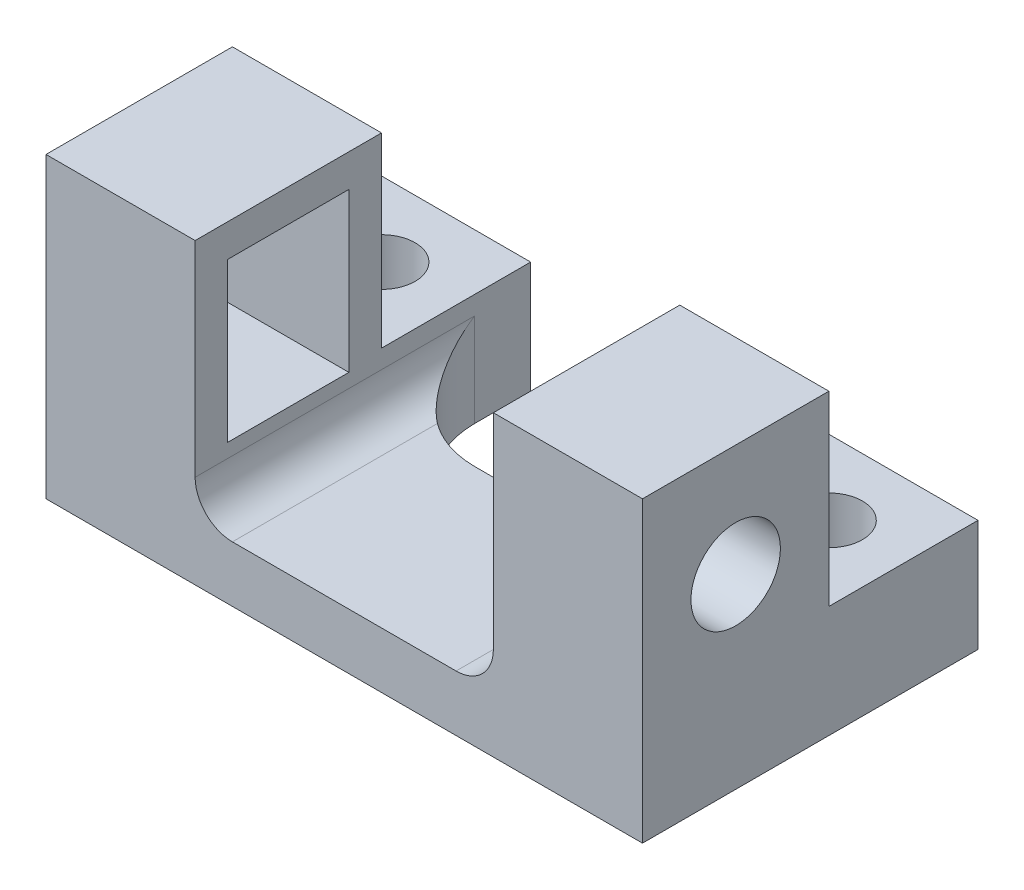
ISO-10303-21;
HEADER;
FILE_DESCRIPTION(('STEP AP214'),'2;1');
FILE_NAME('part.step','',(''),(''),'','','');
FILE_SCHEMA(('AUTOMOTIVE_DESIGN { 1 0 10303 214 1 1 1 1 }'));
ENDSEC;
DATA;
#1=APPLICATION_CONTEXT('core data for automotive mechanical design processes');
#2=APPLICATION_PROTOCOL_DEFINITION('international standard','automotive_design',2000,#1);
#3=PRODUCT_CONTEXT('',#1,'mechanical');
#4=PRODUCT('Part','Part','',(#3));
#5=PRODUCT_RELATED_PRODUCT_CATEGORY('part','',(#4));
#6=PRODUCT_DEFINITION_FORMATION('','',#4);
#7=PRODUCT_DEFINITION_CONTEXT('part definition',#1,'design');
#8=PRODUCT_DEFINITION('design','',#6,#7);
#9=PRODUCT_DEFINITION_SHAPE('','',#8);
#10=(LENGTH_UNIT() NAMED_UNIT(*) SI_UNIT(.MILLI.,.METRE.));
#11=(NAMED_UNIT(*) PLANE_ANGLE_UNIT() SI_UNIT($,.RADIAN.));
#12=(NAMED_UNIT(*) SI_UNIT($,.STERADIAN.) SOLID_ANGLE_UNIT());
#13=UNCERTAINTY_MEASURE_WITH_UNIT(LENGTH_MEASURE(1.E-05),#10,'distance_accuracy_value','');
#14=(GEOMETRIC_REPRESENTATION_CONTEXT(3) GLOBAL_UNCERTAINTY_ASSIGNED_CONTEXT((#13)) GLOBAL_UNIT_ASSIGNED_CONTEXT((#10,
#11,#12)) REPRESENTATION_CONTEXT('',''));
#15=CARTESIAN_POINT('',(0.,0.,0.));
#16=DIRECTION('',(0.,0.,1.));
#17=DIRECTION('',(1.,0.,0.));
#18=AXIS2_PLACEMENT_3D('',#15,#16,#17);
#19=CARTESIAN_POINT('',(-8.,4.,-2.5));
#20=DIRECTION('',(0.,0.,1.));
#21=DIRECTION('',(1.,0.,0.));
#22=AXIS2_PLACEMENT_3D('',#19,#20,#21);
#23=PLANE('',#22);
#24=DIRECTION('',(-1.,0.,0.));
#25=VECTOR('',#24,1.);
#26=CARTESIAN_POINT('',(-8.,-1.,-2.5));
#27=LINE('',#26,#25);
#28=CARTESIAN_POINT('',(-4.,-1.,-2.5));
#29=VERTEX_POINT('',#28);
#30=CARTESIAN_POINT('',(-8.,-1.,-2.5));
#31=VERTEX_POINT('',#30);
#32=EDGE_CURVE('E194',#29,#31,#27,.T.);
#33=ORIENTED_EDGE('',*,*,#32,.T.);
#34=DIRECTION('',(0.,-1.,0.));
#35=VECTOR('',#34,1.);
#36=CARTESIAN_POINT('',(-8.,4.,-2.5));
#37=LINE('',#36,#35);
#38=CARTESIAN_POINT('',(-8.,4.,-2.5));
#39=VERTEX_POINT('',#38);
#40=EDGE_CURVE('E208',#39,#31,#37,.T.);
#41=ORIENTED_EDGE('',*,*,#40,.F.);
#42=DIRECTION('',(-1.,0.,0.));
#43=VECTOR('',#42,1.);
#44=CARTESIAN_POINT('',(-8.,4.,-2.5));
#45=LINE('',#44,#43);
#46=CARTESIAN_POINT('',(-4.,4.,-2.5));
#47=VERTEX_POINT('',#46);
#48=EDGE_CURVE('E307',#47,#39,#45,.T.);
#49=ORIENTED_EDGE('',*,*,#48,.F.);
#50=DIRECTION('',(0.,1.,0.));
#51=VECTOR('',#50,1.);
#52=CARTESIAN_POINT('',(-4.,-2.5,-2.5));
#53=LINE('',#52,#51);
#54=EDGE_CURVE('E297',#29,#47,#53,.T.);
#55=ORIENTED_EDGE('',*,*,#54,.F.);
#56=EDGE_LOOP('',(#33,#41,#49,#55));
#57=FACE_BOUND('',#56,.T.);
#58=ADVANCED_FACE('F33',(#57),#23,.F.);
#59=DIRECTION('',(0.,-1.,0.));
#60=VECTOR('',#59,1.);
#61=CARTESIAN_POINT('',(8.,4.,-2.5));
#62=LINE('',#61,#60);
#63=CARTESIAN_POINT('',(8.,4.,-2.5));
#64=VERTEX_POINT('',#63);
#65=CARTESIAN_POINT('',(8.,-1.,-2.5));
#66=VERTEX_POINT('',#65);
#67=EDGE_CURVE('E332',#64,#66,#62,.T.);
#68=ORIENTED_EDGE('',*,*,#67,.T.);
#69=DIRECTION('',(-1.,0.,0.));
#70=VECTOR('',#69,1.);
#71=CARTESIAN_POINT('',(8.,-1.,-2.5));
#72=LINE('',#71,#70);
#73=CARTESIAN_POINT('',(4.,-1.,-2.5));
#74=VERTEX_POINT('',#73);
#75=EDGE_CURVE('E226',#66,#74,#72,.T.);
#76=ORIENTED_EDGE('',*,*,#75,.T.);
#77=DIRECTION('',(0.,1.,0.));
#78=VECTOR('',#77,1.);
#79=CARTESIAN_POINT('',(4.,-2.5,-2.5));
#80=LINE('',#79,#78);
#81=CARTESIAN_POINT('',(4.,4.,-2.5));
#82=VERTEX_POINT('',#81);
#83=EDGE_CURVE('E291',#74,#82,#80,.T.);
#84=ORIENTED_EDGE('',*,*,#83,.T.);
#85=EDGE_CURVE('E309',#64,#82,#45,.T.);
#86=ORIENTED_EDGE('',*,*,#85,.F.);
#87=EDGE_LOOP('',(#68,#76,#84,#86));
#88=FACE_BOUND('',#87,.T.);
#89=ADVANCED_FACE('F439',(#88),#23,.F.);
#90=DIRECTION('',(-1.,0.,0.));
#91=VECTOR('',#90,1.);
#92=CARTESIAN_POINT('',(-8.,-4.,-2.5));
#93=LINE('',#92,#91);
#94=CARTESIAN_POINT('',(1.5,-4.,-2.5));
#95=VERTEX_POINT('',#94);
#96=CARTESIAN_POINT('',(-1.5,-4.,-2.5));
#97=VERTEX_POINT('',#96);
#98=EDGE_CURVE('E320',#95,#97,#93,.T.);
#99=ORIENTED_EDGE('',*,*,#98,.T.);
#100=DIRECTION('',(0.,-1.,0.));
#101=VECTOR('',#100,1.);
#102=CARTESIAN_POINT('',(-1.5,4.,-2.5));
#103=LINE('',#102,#101);
#104=CARTESIAN_POINT('',(-1.5,-2.5,-2.5));
#105=VERTEX_POINT('',#104);
#106=EDGE_CURVE('E358',#97,#105,#103,.F.);
#107=ORIENTED_EDGE('',*,*,#106,.T.);
#108=DIRECTION('',(1.,0.,0.));
#109=VECTOR('',#108,1.);
#110=CARTESIAN_POINT('',(-4.,-2.5,-2.5));
#111=LINE('',#110,#109);
#112=CARTESIAN_POINT('',(1.5,-2.5,-2.5));
#113=VERTEX_POINT('',#112);
#114=EDGE_CURVE('E287',#105,#113,#111,.T.);
#115=ORIENTED_EDGE('',*,*,#114,.T.);
#116=DIRECTION('',(0.,-1.,0.));
#117=VECTOR('',#116,1.);
#118=CARTESIAN_POINT('',(1.5,4.,-2.5));
#119=LINE('',#118,#117);
#120=EDGE_CURVE('E355',#113,#95,#119,.T.);
#121=ORIENTED_EDGE('',*,*,#120,.T.);
#122=EDGE_LOOP('',(#99,#107,#115,#121));
#123=FACE_BOUND('',#122,.T.);
#124=ADVANCED_FACE('F408',(#123),#23,.F.);
#125=CARTESIAN_POINT('',(-8.,4.,2.5));
#126=DIRECTION('',(0.,0.,-1.));
#127=DIRECTION('',(-1.,0.,0.));
#128=AXIS2_PLACEMENT_3D('',#125,#126,#127);
#129=PLANE('',#128);
#130=DIRECTION('',(0.,1.,0.));
#131=VECTOR('',#130,1.);
#132=CARTESIAN_POINT('',(4.,-2.5,2.5));
#133=LINE('',#132,#131);
#134=CARTESIAN_POINT('',(4.,-1.5,2.5));
#135=VERTEX_POINT('',#134);
#136=CARTESIAN_POINT('',(4.,4.,2.5));
#137=VERTEX_POINT('',#136);
#138=EDGE_CURVE('E301',#135,#137,#133,.T.);
#139=ORIENTED_EDGE('',*,*,#138,.F.);
#140=CARTESIAN_POINT('',(3.,-1.5,2.5));
#141=DIRECTION('',(0.,0.,-1.));
#142=DIRECTION('',(-1.,0.,0.));
#143=AXIS2_PLACEMENT_3D('',#140,#141,#142);
#144=CIRCLE('',#143,1.);
#145=CARTESIAN_POINT('',(3.,-2.5,2.5));
#146=VERTEX_POINT('',#145);
#147=EDGE_CURVE('E350',#135,#146,#144,.T.);
#148=ORIENTED_EDGE('',*,*,#147,.T.);
#149=DIRECTION('',(-1.,0.,0.));
#150=VECTOR('',#149,1.);
#151=CARTESIAN_POINT('',(-4.,-2.5,2.5));
#152=LINE('',#151,#150);
#153=CARTESIAN_POINT('',(-3.,-2.5,2.5));
#154=VERTEX_POINT('',#153);
#155=EDGE_CURVE('E284',#146,#154,#152,.T.);
#156=ORIENTED_EDGE('',*,*,#155,.T.);
#157=CARTESIAN_POINT('',(-3.,-1.5,2.5));
#158=DIRECTION('',(0.,0.,-1.));
#159=DIRECTION('',(-1.,0.,0.));
#160=AXIS2_PLACEMENT_3D('',#157,#158,#159);
#161=CIRCLE('',#160,1.);
#162=CARTESIAN_POINT('',(-4.,-1.5,2.5));
#163=VERTEX_POINT('',#162);
#164=EDGE_CURVE('E348',#154,#163,#161,.T.);
#165=ORIENTED_EDGE('',*,*,#164,.T.);
#166=DIRECTION('',(0.,1.,0.));
#167=VECTOR('',#166,1.);
#168=CARTESIAN_POINT('',(-4.,-2.5,2.5));
#169=LINE('',#168,#167);
#170=CARTESIAN_POINT('',(-4.,4.,2.5));
#171=VERTEX_POINT('',#170);
#172=EDGE_CURVE('E299',#163,#171,#169,.T.);
#173=ORIENTED_EDGE('',*,*,#172,.T.);
#174=DIRECTION('',(1.,0.,0.));
#175=VECTOR('',#174,1.);
#176=CARTESIAN_POINT('',(-8.,4.,2.5));
#177=LINE('',#176,#175);
#178=CARTESIAN_POINT('',(-8.,4.,2.5));
#179=VERTEX_POINT('',#178);
#180=EDGE_CURVE('E315',#179,#171,#177,.T.);
#181=ORIENTED_EDGE('',*,*,#180,.F.);
#182=DIRECTION('',(0.,-1.,0.));
#183=VECTOR('',#182,1.);
#184=CARTESIAN_POINT('',(-8.,4.,2.5));
#185=LINE('',#184,#183);
#186=CARTESIAN_POINT('',(-8.,-4.,2.5));
#187=VERTEX_POINT('',#186);
#188=EDGE_CURVE('E328',#179,#187,#185,.T.);
#189=ORIENTED_EDGE('',*,*,#188,.T.);
#190=DIRECTION('',(1.,0.,0.));
#191=VECTOR('',#190,1.);
#192=CARTESIAN_POINT('',(-8.,-4.,2.5));
#193=LINE('',#192,#191);
#194=CARTESIAN_POINT('',(8.,-4.,2.5));
#195=VERTEX_POINT('',#194);
#196=EDGE_CURVE('E308',#187,#195,#193,.T.);
#197=ORIENTED_EDGE('',*,*,#196,.T.);
#198=DIRECTION('',(0.,-1.,0.));
#199=VECTOR('',#198,1.);
#200=CARTESIAN_POINT('',(8.,4.,2.5));
#201=LINE('',#200,#199);
#202=CARTESIAN_POINT('',(8.,4.,2.5));
#203=VERTEX_POINT('',#202);
#204=EDGE_CURVE('E318',#203,#195,#201,.T.);
#205=ORIENTED_EDGE('',*,*,#204,.F.);
#206=EDGE_CURVE('E314',#137,#203,#177,.T.);
#207=ORIENTED_EDGE('',*,*,#206,.F.);
#208=EDGE_LOOP('',(#139,#148,#156,#165,#173,#181,#189,#197,#205,#207));
#209=FACE_BOUND('',#208,.T.);
#210=ADVANCED_FACE('F414',(#209),#129,.F.);
#211=CARTESIAN_POINT('',(0.,4.,0.));
#212=DIRECTION('',(0.,-1.,0.));
#213=DIRECTION('',(0.,0.,-1.));
#214=AXIS2_PLACEMENT_3D('',#211,#212,#213);
#215=PLANE('',#214);
#216=DIRECTION('',(0.,0.,1.));
#217=VECTOR('',#216,1.);
#218=CARTESIAN_POINT('',(4.,4.,2.5));
#219=LINE('',#218,#217);
#220=EDGE_CURVE('E283',#82,#137,#219,.T.);
#221=ORIENTED_EDGE('',*,*,#220,.T.);
#222=ORIENTED_EDGE('',*,*,#206,.T.);
#223=DIRECTION('',(0.,0.,-1.));
#224=VECTOR('',#223,1.);
#225=CARTESIAN_POINT('',(8.,4.,2.5));
#226=LINE('',#225,#224);
#227=EDGE_CURVE('E304',#203,#64,#226,.T.);
#228=ORIENTED_EDGE('',*,*,#227,.T.);
#229=ORIENTED_EDGE('',*,*,#85,.T.);
#230=EDGE_LOOP('',(#221,#222,#228,#229));
#231=FACE_BOUND('',#230,.T.);
#232=ADVANCED_FACE('F434',(#231),#215,.F.);
#233=DIRECTION('',(0.,0.,-1.));
#234=VECTOR('',#233,1.);
#235=CARTESIAN_POINT('',(-4.,4.,2.5));
#236=LINE('',#235,#234);
#237=EDGE_CURVE('E288',#171,#47,#236,.T.);
#238=ORIENTED_EDGE('',*,*,#237,.T.);
#239=ORIENTED_EDGE('',*,*,#48,.T.);
#240=DIRECTION('',(0.,0.,1.));
#241=VECTOR('',#240,1.);
#242=CARTESIAN_POINT('',(-8.,4.,2.5));
#243=LINE('',#242,#241);
#244=EDGE_CURVE('E312',#39,#179,#243,.T.);
#245=ORIENTED_EDGE('',*,*,#244,.T.);
#246=ORIENTED_EDGE('',*,*,#180,.T.);
#247=EDGE_LOOP('',(#238,#239,#245,#246));
#248=FACE_BOUND('',#247,.T.);
#249=ADVANCED_FACE('F425',(#248),#215,.F.);
#250=CARTESIAN_POINT('',(8.,4.,2.5));
#251=DIRECTION('',(-1.,0.,0.));
#252=DIRECTION('',(0.,0.,1.));
#253=AXIS2_PLACEMENT_3D('',#250,#251,#252);
#254=PLANE('',#253);
#255=CARTESIAN_POINT('',(8.,1.,0.));
#256=DIRECTION('',(1.,0.,0.));
#257=DIRECTION('',(0.,0.,-1.));
#258=AXIS2_PLACEMENT_3D('',#255,#256,#257);
#259=CIRCLE('',#258,1.19999999999999);
#260=CARTESIAN_POINT('',(8.,1.,-1.19999999999999));
#261=VERTEX_POINT('',#260);
#262=EDGE_CURVE('E243',#261,#261,#259,.T.);
#263=ORIENTED_EDGE('',*,*,#262,.F.);
#264=EDGE_LOOP('',(#263));
#265=FACE_BOUND('',#264,.T.);
#266=DIRECTION('',(0.,0.,-1.));
#267=VECTOR('',#266,1.);
#268=CARTESIAN_POINT('',(8.,-4.,2.5));
#269=LINE('',#268,#267);
#270=CARTESIAN_POINT('',(8.,-4.,-6.5));
#271=VERTEX_POINT('',#270);
#272=EDGE_CURVE('E303',#195,#271,#269,.T.);
#273=ORIENTED_EDGE('',*,*,#272,.T.);
#274=DIRECTION('',(0.,-1.,0.));
#275=VECTOR('',#274,1.);
#276=CARTESIAN_POINT('',(8.,-1.,-6.5));
#277=LINE('',#276,#275);
#278=CARTESIAN_POINT('',(8.,-1.,-6.5));
#279=VERTEX_POINT('',#278);
#280=EDGE_CURVE('E240',#279,#271,#277,.T.);
#281=ORIENTED_EDGE('',*,*,#280,.F.);
#282=DIRECTION('',(0.,0.,1.));
#283=VECTOR('',#282,1.);
#284=CARTESIAN_POINT('',(8.,-1.,-2.5));
#285=LINE('',#284,#283);
#286=EDGE_CURVE('E223',#279,#66,#285,.T.);
#287=ORIENTED_EDGE('',*,*,#286,.T.);
#288=ORIENTED_EDGE('',*,*,#67,.F.);
#289=ORIENTED_EDGE('',*,*,#227,.F.);
#290=ORIENTED_EDGE('',*,*,#204,.T.);
#291=EDGE_LOOP('',(#273,#281,#287,#288,#289,#290));
#292=FACE_BOUND('',#291,.T.);
#293=ADVANCED_FACE('F431',(#265,#292),#254,.F.);
#294=CARTESIAN_POINT('',(-8.,4.,2.5));
#295=DIRECTION('',(1.,0.,0.));
#296=DIRECTION('',(0.,0.,-1.));
#297=AXIS2_PLACEMENT_3D('',#294,#295,#296);
#298=PLANE('',#297);
#299=DIRECTION('',(0.,1.,0.));
#300=VECTOR('',#299,1.);
#301=CARTESIAN_POINT('',(-8.,3.125,1.625));
#302=LINE('',#301,#300);
#303=CARTESIAN_POINT('',(-8.,-1.125,1.625));
#304=VERTEX_POINT('',#303);
#305=CARTESIAN_POINT('',(-8.,3.125,1.625));
#306=VERTEX_POINT('',#305);
#307=EDGE_CURVE('E255',#304,#306,#302,.T.);
#308=ORIENTED_EDGE('',*,*,#307,.F.);
#309=DIRECTION('',(0.,0.,1.));
#310=VECTOR('',#309,1.);
#311=CARTESIAN_POINT('',(-8.,-1.125,-1.625));
#312=LINE('',#311,#310);
#313=CARTESIAN_POINT('',(-8.,-1.125,-1.625));
#314=VERTEX_POINT('',#313);
#315=EDGE_CURVE('E258',#314,#304,#312,.T.);
#316=ORIENTED_EDGE('',*,*,#315,.F.);
#317=DIRECTION('',(0.,-1.,0.));
#318=VECTOR('',#317,1.);
#319=CARTESIAN_POINT('',(-8.,3.125,-1.625));
#320=LINE('',#319,#318);
#321=CARTESIAN_POINT('',(-8.,3.125,-1.625));
#322=VERTEX_POINT('',#321);
#323=EDGE_CURVE('E251',#322,#314,#320,.T.);
#324=ORIENTED_EDGE('',*,*,#323,.F.);
#325=DIRECTION('',(0.,0.,-1.));
#326=VECTOR('',#325,1.);
#327=CARTESIAN_POINT('',(-8.,3.125,-1.625));
#328=LINE('',#327,#326);
#329=EDGE_CURVE('E252',#306,#322,#328,.T.);
#330=ORIENTED_EDGE('',*,*,#329,.F.);
#331=EDGE_LOOP('',(#308,#316,#324,#330));
#332=FACE_BOUND('',#331,.T.);
#333=DIRECTION('',(0.,0.,1.));
#334=VECTOR('',#333,1.);
#335=CARTESIAN_POINT('',(-8.,-4.,2.5));
#336=LINE('',#335,#334);
#337=CARTESIAN_POINT('',(-8.,-4.,-6.5));
#338=VERTEX_POINT('',#337);
#339=EDGE_CURVE('E323',#338,#187,#336,.T.);
#340=ORIENTED_EDGE('',*,*,#339,.T.);
#341=ORIENTED_EDGE('',*,*,#188,.F.);
#342=ORIENTED_EDGE('',*,*,#244,.F.);
#343=ORIENTED_EDGE('',*,*,#40,.T.);
#344=DIRECTION('',(0.,0.,-1.));
#345=VECTOR('',#344,1.);
#346=CARTESIAN_POINT('',(-8.,-1.,-2.5));
#347=LINE('',#346,#345);
#348=CARTESIAN_POINT('',(-8.,-1.,-6.5));
#349=VERTEX_POINT('',#348);
#350=EDGE_CURVE('E199',#31,#349,#347,.T.);
#351=ORIENTED_EDGE('',*,*,#350,.T.);
#352=DIRECTION('',(0.,-1.,0.));
#353=VECTOR('',#352,1.);
#354=CARTESIAN_POINT('',(-8.,-1.,-6.5));
#355=LINE('',#354,#353);
#356=EDGE_CURVE('E185',#349,#338,#355,.T.);
#357=ORIENTED_EDGE('',*,*,#356,.T.);
#358=EDGE_LOOP('',(#340,#341,#342,#343,#351,#357));
#359=FACE_BOUND('',#358,.T.);
#360=ADVANCED_FACE('F205',(#332,#359),#298,.F.);
#361=CARTESIAN_POINT('',(0.,-4.,0.));
#362=DIRECTION('',(0.,-1.,0.));
#363=DIRECTION('',(0.,0.,-1.));
#364=AXIS2_PLACEMENT_3D('',#361,#362,#363);
#365=PLANE('',#364);
#366=CARTESIAN_POINT('',(6.,-4.,-4.5));
#367=DIRECTION('',(0.,-1.,0.));
#368=DIRECTION('',(0.,0.,-1.));
#369=AXIS2_PLACEMENT_3D('',#366,#367,#368);
#370=CIRCLE('',#369,0.899999999999999);
#371=CARTESIAN_POINT('',(6.,-4.,-5.4));
#372=VERTEX_POINT('',#371);
#373=EDGE_CURVE('E338',#372,#372,#370,.T.);
#374=ORIENTED_EDGE('',*,*,#373,.F.);
#375=EDGE_LOOP('',(#374));
#376=FACE_BOUND('',#375,.T.);
#377=CARTESIAN_POINT('',(-6.,-4.,-4.5));
#378=DIRECTION('',(0.,-1.,0.));
#379=DIRECTION('',(0.,0.,-1.));
#380=AXIS2_PLACEMENT_3D('',#377,#378,#379);
#381=CIRCLE('',#380,0.899999999999999);
#382=CARTESIAN_POINT('',(-6.,-4.,-5.4));
#383=VERTEX_POINT('',#382);
#384=EDGE_CURVE('E219',#383,#383,#381,.T.);
#385=ORIENTED_EDGE('',*,*,#384,.F.);
#386=EDGE_LOOP('',(#385));
#387=FACE_BOUND('',#386,.T.);
#388=ORIENTED_EDGE('',*,*,#272,.F.);
#389=ORIENTED_EDGE('',*,*,#196,.F.);
#390=ORIENTED_EDGE('',*,*,#339,.F.);
#391=DIRECTION('',(1.,0.,0.));
#392=VECTOR('',#391,1.);
#393=CARTESIAN_POINT('',(-8.,-4.,-6.5));
#394=LINE('',#393,#392);
#395=CARTESIAN_POINT('',(-4.,-4.,-6.5));
#396=VERTEX_POINT('',#395);
#397=EDGE_CURVE('E190',#338,#396,#394,.T.);
#398=ORIENTED_EDGE('',*,*,#397,.T.);
#399=DIRECTION('',(0.,0.,1.));
#400=VECTOR('',#399,1.);
#401=CARTESIAN_POINT('',(-4.,-4.,-2.5));
#402=LINE('',#401,#400);
#403=CARTESIAN_POINT('',(-4.,-4.,-5.));
#404=VERTEX_POINT('',#403);
#405=EDGE_CURVE('E209',#396,#404,#402,.T.);
#406=ORIENTED_EDGE('',*,*,#405,.T.);
#407=CARTESIAN_POINT('',(-1.5,-4.,-5.));
#408=DIRECTION('',(0.,-1.,0.));
#409=DIRECTION('',(0.,0.,-1.));
#410=AXIS2_PLACEMENT_3D('',#407,#408,#409);
#411=CIRCLE('',#410,2.5);
#412=EDGE_CURVE('E363',#404,#97,#411,.F.);
#413=ORIENTED_EDGE('',*,*,#412,.T.);
#414=ORIENTED_EDGE('',*,*,#98,.F.);
#415=CARTESIAN_POINT('',(1.5,-4.,-5.));
#416=DIRECTION('',(0.,-1.,0.));
#417=DIRECTION('',(0.,0.,-1.));
#418=AXIS2_PLACEMENT_3D('',#415,#416,#417);
#419=CIRCLE('',#418,2.5);
#420=CARTESIAN_POINT('',(4.,-4.,-5.));
#421=VERTEX_POINT('',#420);
#422=EDGE_CURVE('E374',#95,#421,#419,.F.);
#423=ORIENTED_EDGE('',*,*,#422,.T.);
#424=DIRECTION('',(0.,0.,-1.));
#425=VECTOR('',#424,1.);
#426=CARTESIAN_POINT('',(4.,-4.,-2.5));
#427=LINE('',#426,#425);
#428=CARTESIAN_POINT('',(4.,-4.,-6.5));
#429=VERTEX_POINT('',#428);
#430=EDGE_CURVE('E221',#421,#429,#427,.T.);
#431=ORIENTED_EDGE('',*,*,#430,.T.);
#432=DIRECTION('',(1.,0.,0.));
#433=VECTOR('',#432,1.);
#434=CARTESIAN_POINT('',(8.,-4.,-6.5));
#435=LINE('',#434,#433);
#436=EDGE_CURVE('E227',#429,#271,#435,.T.);
#437=ORIENTED_EDGE('',*,*,#436,.T.);
#438=EDGE_LOOP('',(#388,#389,#390,#398,#406,#413,#414,#423,#431,#437));
#439=FACE_BOUND('',#438,.T.);
#440=ADVANCED_FACE('F397',(#376,#387,#439),#365,.T.);
#441=CARTESIAN_POINT('',(4.,-2.5,2.5));
#442=DIRECTION('',(-1.,0.,0.));
#443=DIRECTION('',(0.,0.,1.));
#444=AXIS2_PLACEMENT_3D('',#441,#442,#443);
#445=PLANE('',#444);
#446=CARTESIAN_POINT('',(4.,1.,0.));
#447=DIRECTION('',(1.,0.,0.));
#448=DIRECTION('',(0.,0.,-1.));
#449=AXIS2_PLACEMENT_3D('',#446,#447,#448);
#450=CIRCLE('',#449,1.19999999999999);
#451=CARTESIAN_POINT('',(4.,1.,-1.19999999999999));
#452=VERTEX_POINT('',#451);
#453=EDGE_CURVE('E248',#452,#452,#450,.T.);
#454=ORIENTED_EDGE('',*,*,#453,.T.);
#455=EDGE_LOOP('',(#454));
#456=FACE_BOUND('',#455,.T.);
#457=ORIENTED_EDGE('',*,*,#430,.F.);
#458=DIRECTION('',(0.,-1.,0.));
#459=VECTOR('',#458,1.);
#460=CARTESIAN_POINT('',(4.,-2.5,-5.));
#461=LINE('',#460,#459);
#462=CARTESIAN_POINT('',(4.,-1.5,-5.));
#463=VERTEX_POINT('',#462);
#464=EDGE_CURVE('E360',#421,#463,#461,.F.);
#465=ORIENTED_EDGE('',*,*,#464,.T.);
#466=DIRECTION('',(0.,0.,1.));
#467=VECTOR('',#466,1.);
#468=CARTESIAN_POINT('',(4.,-1.5,2.5));
#469=LINE('',#468,#467);
#470=EDGE_CURVE('E345',#463,#135,#469,.T.);
#471=ORIENTED_EDGE('',*,*,#470,.T.);
#472=ORIENTED_EDGE('',*,*,#138,.T.);
#473=ORIENTED_EDGE('',*,*,#220,.F.);
#474=ORIENTED_EDGE('',*,*,#83,.F.);
#475=DIRECTION('',(0.,0.,-1.));
#476=VECTOR('',#475,1.);
#477=CARTESIAN_POINT('',(4.,-1.,-2.5));
#478=LINE('',#477,#476);
#479=CARTESIAN_POINT('',(4.,-1.,-6.5));
#480=VERTEX_POINT('',#479);
#481=EDGE_CURVE('E230',#74,#480,#478,.T.);
#482=ORIENTED_EDGE('',*,*,#481,.T.);
#483=DIRECTION('',(0.,-1.,0.));
#484=VECTOR('',#483,1.);
#485=CARTESIAN_POINT('',(4.,-1.,-6.5));
#486=LINE('',#485,#484);
#487=EDGE_CURVE('E236',#480,#429,#486,.T.);
#488=ORIENTED_EDGE('',*,*,#487,.T.);
#489=EDGE_LOOP('',(#457,#465,#471,#472,#473,#474,#482,#488));
#490=FACE_BOUND('',#489,.T.);
#491=ADVANCED_FACE('F402',(#456,#490),#445,.T.);
#492=CARTESIAN_POINT('',(-4.,-2.5,2.5));
#493=DIRECTION('',(1.,0.,0.));
#494=DIRECTION('',(0.,0.,-1.));
#495=AXIS2_PLACEMENT_3D('',#492,#493,#494);
#496=PLANE('',#495);
#497=DIRECTION('',(0.,0.,1.));
#498=VECTOR('',#497,1.);
#499=CARTESIAN_POINT('',(-4.,-1.125,-1.625));
#500=LINE('',#499,#498);
#501=CARTESIAN_POINT('',(-4.,-1.125,-1.625));
#502=VERTEX_POINT('',#501);
#503=CARTESIAN_POINT('',(-4.,-1.125,1.625));
#504=VERTEX_POINT('',#503);
#505=EDGE_CURVE('E254',#502,#504,#500,.T.);
#506=ORIENTED_EDGE('',*,*,#505,.T.);
#507=DIRECTION('',(0.,1.,0.));
#508=VECTOR('',#507,1.);
#509=CARTESIAN_POINT('',(-4.,3.125,1.625));
#510=LINE('',#509,#508);
#511=CARTESIAN_POINT('',(-4.,3.125,1.625));
#512=VERTEX_POINT('',#511);
#513=EDGE_CURVE('E275',#504,#512,#510,.T.);
#514=ORIENTED_EDGE('',*,*,#513,.T.);
#515=DIRECTION('',(0.,0.,-1.));
#516=VECTOR('',#515,1.);
#517=CARTESIAN_POINT('',(-4.,3.125,-1.625));
#518=LINE('',#517,#516);
#519=CARTESIAN_POINT('',(-4.,3.125,-1.625));
#520=VERTEX_POINT('',#519);
#521=EDGE_CURVE('E271',#512,#520,#518,.T.);
#522=ORIENTED_EDGE('',*,*,#521,.T.);
#523=DIRECTION('',(0.,-1.,0.));
#524=VECTOR('',#523,1.);
#525=CARTESIAN_POINT('',(-4.,3.125,-1.625));
#526=LINE('',#525,#524);
#527=EDGE_CURVE('E266',#520,#502,#526,.T.);
#528=ORIENTED_EDGE('',*,*,#527,.T.);
#529=EDGE_LOOP('',(#506,#514,#522,#528));
#530=FACE_BOUND('',#529,.T.);
#531=DIRECTION('',(0.,0.,-1.));
#532=VECTOR('',#531,1.);
#533=CARTESIAN_POINT('',(-4.,-1.5,2.5));
#534=LINE('',#533,#532);
#535=CARTESIAN_POINT('',(-4.,-1.5,-5.));
#536=VERTEX_POINT('',#535);
#537=EDGE_CURVE('E335',#163,#536,#534,.T.);
#538=ORIENTED_EDGE('',*,*,#537,.T.);
#539=DIRECTION('',(0.,-1.,0.));
#540=VECTOR('',#539,1.);
#541=CARTESIAN_POINT('',(-4.,-2.5,-5.));
#542=LINE('',#541,#540);
#543=EDGE_CURVE('E352',#536,#404,#542,.T.);
#544=ORIENTED_EDGE('',*,*,#543,.T.);
#545=ORIENTED_EDGE('',*,*,#405,.F.);
#546=DIRECTION('',(0.,-1.,0.));
#547=VECTOR('',#546,1.);
#548=CARTESIAN_POINT('',(-4.,-1.,-6.5));
#549=LINE('',#548,#547);
#550=CARTESIAN_POINT('',(-4.,-1.,-6.5));
#551=VERTEX_POINT('',#550);
#552=EDGE_CURVE('E193',#551,#396,#549,.T.);
#553=ORIENTED_EDGE('',*,*,#552,.F.);
#554=DIRECTION('',(0.,0.,1.));
#555=VECTOR('',#554,1.);
#556=CARTESIAN_POINT('',(-4.,-1.,-2.5));
#557=LINE('',#556,#555);
#558=EDGE_CURVE('E202',#551,#29,#557,.T.);
#559=ORIENTED_EDGE('',*,*,#558,.T.);
#560=ORIENTED_EDGE('',*,*,#54,.T.);
#561=ORIENTED_EDGE('',*,*,#237,.F.);
#562=ORIENTED_EDGE('',*,*,#172,.F.);
#563=EDGE_LOOP('',(#538,#544,#545,#553,#559,#560,#561,#562));
#564=FACE_BOUND('',#563,.T.);
#565=ADVANCED_FACE('F418',(#530,#564),#496,.T.);
#566=CARTESIAN_POINT('',(0.,-2.5,0.));
#567=DIRECTION('',(0.,-1.,0.));
#568=DIRECTION('',(0.,0.,-1.));
#569=AXIS2_PLACEMENT_3D('',#566,#567,#568);
#570=PLANE('',#569);
#571=ORIENTED_EDGE('',*,*,#114,.F.);
#572=CARTESIAN_POINT('',(-1.5,-2.5,-5.));
#573=DIRECTION('',(0.,-1.,0.));
#574=DIRECTION('',(0.,0.,-1.));
#575=AXIS2_PLACEMENT_3D('',#572,#573,#574);
#576=CIRCLE('',#575,2.5);
#577=CARTESIAN_POINT('',(-3.,-2.5,-2.99999999999967));
#578=VERTEX_POINT('',#577);
#579=EDGE_CURVE('E365',#105,#578,#576,.T.);
#580=ORIENTED_EDGE('',*,*,#579,.T.);
#581=DIRECTION('',(0.,0.,-1.));
#582=VECTOR('',#581,1.);
#583=CARTESIAN_POINT('',(-3.,-2.5,0.));
#584=LINE('',#583,#582);
#585=EDGE_CURVE('E56',#578,#154,#584,.F.);
#586=ORIENTED_EDGE('',*,*,#585,.T.);
#587=ORIENTED_EDGE('',*,*,#155,.F.);
#588=DIRECTION('',(0.,0.,1.));
#589=VECTOR('',#588,1.);
#590=CARTESIAN_POINT('',(3.,-2.5,0.));
#591=LINE('',#590,#589);
#592=CARTESIAN_POINT('',(3.,-2.5,-2.99999999999967));
#593=VERTEX_POINT('',#592);
#594=EDGE_CURVE('E48',#146,#593,#591,.F.);
#595=ORIENTED_EDGE('',*,*,#594,.T.);
#596=CARTESIAN_POINT('',(1.5,-2.5,-5.));
#597=DIRECTION('',(0.,-1.,0.));
#598=DIRECTION('',(0.,0.,-1.));
#599=AXIS2_PLACEMENT_3D('',#596,#597,#598);
#600=CIRCLE('',#599,2.5);
#601=EDGE_CURVE('E11',#593,#113,#600,.T.);
#602=ORIENTED_EDGE('',*,*,#601,.T.);
#603=EDGE_LOOP('',(#571,#580,#586,#587,#595,#602));
#604=FACE_BOUND('',#603,.T.);
#605=ADVANCED_FACE('F405',(#604),#570,.F.);
#606=CARTESIAN_POINT('',(1.35023363975818,-1.125,-1.625));
#607=DIRECTION('',(0.,-1.,0.));
#608=DIRECTION('',(0.,0.,-1.));
#609=AXIS2_PLACEMENT_3D('',#606,#607,#608);
#610=PLANE('',#609);
#611=DIRECTION('',(-1.,0.,0.));
#612=VECTOR('',#611,1.);
#613=CARTESIAN_POINT('',(1.35023363975818,-1.125,-1.625));
#614=LINE('',#613,#612);
#615=EDGE_CURVE('E269',#502,#314,#614,.T.);
#616=ORIENTED_EDGE('',*,*,#615,.T.);
#617=ORIENTED_EDGE('',*,*,#315,.T.);
#618=DIRECTION('',(-1.,0.,0.));
#619=VECTOR('',#618,1.);
#620=CARTESIAN_POINT('',(1.35023363975818,-1.125,1.625));
#621=LINE('',#620,#619);
#622=EDGE_CURVE('E265',#504,#304,#621,.T.);
#623=ORIENTED_EDGE('',*,*,#622,.F.);
#624=ORIENTED_EDGE('',*,*,#505,.F.);
#625=EDGE_LOOP('',(#616,#617,#623,#624));
#626=FACE_BOUND('',#625,.T.);
#627=ADVANCED_FACE('F497',(#626),#610,.F.);
#628=CARTESIAN_POINT('',(1.35023363975818,3.125,1.625));
#629=DIRECTION('',(0.,0.,1.));
#630=DIRECTION('',(0.,-1.,0.));
#631=AXIS2_PLACEMENT_3D('',#628,#629,#630);
#632=PLANE('',#631);
#633=ORIENTED_EDGE('',*,*,#622,.T.);
#634=ORIENTED_EDGE('',*,*,#307,.T.);
#635=DIRECTION('',(-1.,0.,0.));
#636=VECTOR('',#635,1.);
#637=CARTESIAN_POINT('',(1.35023363975818,3.125,1.625));
#638=LINE('',#637,#636);
#639=EDGE_CURVE('E274',#512,#306,#638,.T.);
#640=ORIENTED_EDGE('',*,*,#639,.F.);
#641=ORIENTED_EDGE('',*,*,#513,.F.);
#642=EDGE_LOOP('',(#633,#634,#640,#641));
#643=FACE_BOUND('',#642,.T.);
#644=ADVANCED_FACE('F493',(#643),#632,.F.);
#645=CARTESIAN_POINT('',(1.35023363975818,3.125,-1.625));
#646=DIRECTION('',(0.,1.,0.));
#647=DIRECTION('',(0.,0.,1.));
#648=AXIS2_PLACEMENT_3D('',#645,#646,#647);
#649=PLANE('',#648);
#650=ORIENTED_EDGE('',*,*,#639,.T.);
#651=ORIENTED_EDGE('',*,*,#329,.T.);
#652=DIRECTION('',(-1.,0.,0.));
#653=VECTOR('',#652,1.);
#654=CARTESIAN_POINT('',(1.35023363975818,3.125,-1.625));
#655=LINE('',#654,#653);
#656=EDGE_CURVE('E270',#520,#322,#655,.T.);
#657=ORIENTED_EDGE('',*,*,#656,.F.);
#658=ORIENTED_EDGE('',*,*,#521,.F.);
#659=EDGE_LOOP('',(#650,#651,#657,#658));
#660=FACE_BOUND('',#659,.T.);
#661=ADVANCED_FACE('F501',(#660),#649,.F.);
#662=CARTESIAN_POINT('',(1.35023363975818,3.125,-1.625));
#663=DIRECTION('',(0.,0.,-1.));
#664=DIRECTION('',(0.,1.,0.));
#665=AXIS2_PLACEMENT_3D('',#662,#663,#664);
#666=PLANE('',#665);
#667=ORIENTED_EDGE('',*,*,#656,.T.);
#668=ORIENTED_EDGE('',*,*,#323,.T.);
#669=ORIENTED_EDGE('',*,*,#615,.F.);
#670=ORIENTED_EDGE('',*,*,#527,.F.);
#671=EDGE_LOOP('',(#667,#668,#669,#670));
#672=FACE_BOUND('',#671,.T.);
#673=ADVANCED_FACE('F456',(#672),#666,.F.);
#674=CARTESIAN_POINT('',(8.,1.,0.));
#675=DIRECTION('',(1.,0.,0.));
#676=DIRECTION('',(0.,0.,-1.));
#677=AXIS2_PLACEMENT_3D('',#674,#675,#676);
#678=CYLINDRICAL_SURFACE('',#677,1.19999999999999);
#679=ORIENTED_EDGE('',*,*,#453,.F.);
#680=EDGE_LOOP('',(#679));
#681=FACE_BOUND('',#680,.T.);
#682=ORIENTED_EDGE('',*,*,#262,.T.);
#683=EDGE_LOOP('',(#682));
#684=FACE_BOUND('',#683,.T.);
#685=ADVANCED_FACE('F446',(#681,#684),#678,.F.);
#686=CARTESIAN_POINT('',(8.,-1.,-6.5));
#687=DIRECTION('',(0.,0.,-1.));
#688=DIRECTION('',(-1.,0.,0.));
#689=AXIS2_PLACEMENT_3D('',#686,#687,#688);
#690=PLANE('',#689);
#691=ORIENTED_EDGE('',*,*,#436,.F.);
#692=ORIENTED_EDGE('',*,*,#487,.F.);
#693=DIRECTION('',(1.,0.,0.));
#694=VECTOR('',#693,1.);
#695=CARTESIAN_POINT('',(8.,-1.,-6.5));
#696=LINE('',#695,#694);
#697=EDGE_CURVE('E233',#480,#279,#696,.T.);
#698=ORIENTED_EDGE('',*,*,#697,.T.);
#699=ORIENTED_EDGE('',*,*,#280,.T.);
#700=EDGE_LOOP('',(#691,#692,#698,#699));
#701=FACE_BOUND('',#700,.T.);
#702=ADVANCED_FACE('F444',(#701),#690,.T.);
#703=CARTESIAN_POINT('',(0.,-1.,0.));
#704=DIRECTION('',(0.,1.,0.));
#705=DIRECTION('',(0.,0.,1.));
#706=AXIS2_PLACEMENT_3D('',#703,#704,#705);
#707=PLANE('',#706);
#708=CARTESIAN_POINT('',(6.,-1.,-4.5));
#709=DIRECTION('',(0.,1.,0.));
#710=DIRECTION('',(0.,0.,1.));
#711=AXIS2_PLACEMENT_3D('',#708,#709,#710);
#712=CIRCLE('',#711,0.9);
#713=CARTESIAN_POINT('',(6.,-1.,-3.6));
#714=VERTEX_POINT('',#713);
#715=EDGE_CURVE('E341',#714,#714,#712,.T.);
#716=ORIENTED_EDGE('',*,*,#715,.F.);
#717=EDGE_LOOP('',(#716));
#718=FACE_BOUND('',#717,.T.);
#719=ORIENTED_EDGE('',*,*,#286,.F.);
#720=ORIENTED_EDGE('',*,*,#697,.F.);
#721=ORIENTED_EDGE('',*,*,#481,.F.);
#722=ORIENTED_EDGE('',*,*,#75,.F.);
#723=EDGE_LOOP('',(#719,#720,#721,#722));
#724=FACE_BOUND('',#723,.T.);
#725=ADVANCED_FACE('F442',(#718,#724),#707,.T.);
#726=CARTESIAN_POINT('',(-8.,-1.,-6.5));
#727=DIRECTION('',(0.,0.,-1.));
#728=DIRECTION('',(-1.,0.,0.));
#729=AXIS2_PLACEMENT_3D('',#726,#727,#728);
#730=PLANE('',#729);
#731=ORIENTED_EDGE('',*,*,#397,.F.);
#732=ORIENTED_EDGE('',*,*,#356,.F.);
#733=DIRECTION('',(1.,0.,0.));
#734=VECTOR('',#733,1.);
#735=CARTESIAN_POINT('',(-8.,-1.,-6.5));
#736=LINE('',#735,#734);
#737=EDGE_CURVE('E188',#349,#551,#736,.T.);
#738=ORIENTED_EDGE('',*,*,#737,.T.);
#739=ORIENTED_EDGE('',*,*,#552,.T.);
#740=EDGE_LOOP('',(#731,#732,#738,#739));
#741=FACE_BOUND('',#740,.T.);
#742=ADVANCED_FACE('F187',(#741),#730,.T.);
#743=CARTESIAN_POINT('',(0.,-1.,0.));
#744=DIRECTION('',(0.,-1.,0.));
#745=DIRECTION('',(0.,0.,-1.));
#746=AXIS2_PLACEMENT_3D('',#743,#744,#745);
#747=PLANE('',#746);
#748=CARTESIAN_POINT('',(-6.,-1.,-4.5));
#749=DIRECTION('',(0.,1.,0.));
#750=DIRECTION('',(0.,0.,1.));
#751=AXIS2_PLACEMENT_3D('',#748,#749,#750);
#752=CIRCLE('',#751,0.9);
#753=CARTESIAN_POINT('',(-6.,-1.,-3.6));
#754=VERTEX_POINT('',#753);
#755=EDGE_CURVE('E214',#754,#754,#752,.T.);
#756=ORIENTED_EDGE('',*,*,#755,.F.);
#757=EDGE_LOOP('',(#756));
#758=FACE_BOUND('',#757,.T.);
#759=ORIENTED_EDGE('',*,*,#350,.F.);
#760=ORIENTED_EDGE('',*,*,#32,.F.);
#761=ORIENTED_EDGE('',*,*,#558,.F.);
#762=ORIENTED_EDGE('',*,*,#737,.F.);
#763=EDGE_LOOP('',(#759,#760,#761,#762));
#764=FACE_BOUND('',#763,.T.);
#765=ADVANCED_FACE('F198',(#758,#764),#747,.F.);
#766=CARTESIAN_POINT('',(-6.,-1.,-4.5));
#767=DIRECTION('',(0.,1.,0.));
#768=DIRECTION('',(0.,0.,1.));
#769=AXIS2_PLACEMENT_3D('',#766,#767,#768);
#770=CYLINDRICAL_SURFACE('',#769,0.899999999999999);
#771=ORIENTED_EDGE('',*,*,#384,.T.);
#772=EDGE_LOOP('',(#771));
#773=FACE_BOUND('',#772,.T.);
#774=ORIENTED_EDGE('',*,*,#755,.T.);
#775=EDGE_LOOP('',(#774));
#776=FACE_BOUND('',#775,.T.);
#777=ADVANCED_FACE('F572',(#773,#776),#770,.F.);
#778=CARTESIAN_POINT('',(6.,-1.,-4.5));
#779=DIRECTION('',(0.,1.,0.));
#780=DIRECTION('',(0.,0.,1.));
#781=AXIS2_PLACEMENT_3D('',#778,#779,#780);
#782=CYLINDRICAL_SURFACE('',#781,0.899999999999999);
#783=ORIENTED_EDGE('',*,*,#373,.T.);
#784=EDGE_LOOP('',(#783));
#785=FACE_BOUND('',#784,.T.);
#786=ORIENTED_EDGE('',*,*,#715,.T.);
#787=EDGE_LOOP('',(#786));
#788=FACE_BOUND('',#787,.T.);
#789=ADVANCED_FACE('F579',(#785,#788),#782,.F.);
#790=CARTESIAN_POINT('',(-3.,-1.5,2.5));
#791=DIRECTION('',(0.,0.,-1.));
#792=DIRECTION('',(-1.,0.,0.));
#793=AXIS2_PLACEMENT_3D('',#790,#791,#792);
#794=CYLINDRICAL_SURFACE('',#793,1.);
#795=ORIENTED_EDGE('',*,*,#164,.F.);
#796=ORIENTED_EDGE('',*,*,#585,.F.);
#797=CARTESIAN_POINT('',(-3.,-2.5,-2.99999999999967));
#798=CARTESIAN_POINT('',(-3.03421120874021,-2.49999597559318,-3.02565128338779));
#799=CARTESIAN_POINT('',(-3.06772297895691,-2.4982454623019,-3.05216376968815));
#800=CARTESIAN_POINT('',(-3.13311650247064,-2.49164486192553,-3.10666106606112));
#801=CARTESIAN_POINT('',(-3.16500097299606,-2.48680013741237,-3.13464325214709));
#802=CARTESIAN_POINT('',(-3.25742787498592,-2.46832538215328,-3.21999134375561));
#803=CARTESIAN_POINT('',(-3.3154263840069,-2.45073876930685,-3.27927402642896));
#804=CARTESIAN_POINT('',(-3.44699163439282,-2.39840805927538,-3.42748684800045));
#805=CARTESIAN_POINT('',(-3.51671959731349,-2.35954997704738,-3.51832194409374));
#806=CARTESIAN_POINT('',(-3.64156776486505,-2.27090106786571,-3.70523302617127));
#807=CARTESIAN_POINT('',(-3.69659547167421,-2.22104445881381,-3.8013378141029));
#808=CARTESIAN_POINT('',(-3.77834958479086,-2.12987419916042,-3.96799406828529));
#809=CARTESIAN_POINT('',(-3.80864712066632,-2.09032215504914,-4.03780513225424));
#810=CARTESIAN_POINT('',(-3.86238926030982,-2.00860341766354,-4.17854155787805));
#811=CARTESIAN_POINT('',(-3.88583083782694,-1.96643557969021,-4.24946739708819));
#812=CARTESIAN_POINT('',(-3.94613120115855,-1.83740514110442,-4.46305979399966));
#813=CARTESIAN_POINT('',(-3.97316437000286,-1.74778070302685,-4.60695683982885));
#814=CARTESIAN_POINT('',(-3.99559347075034,-1.60671816007266,-4.83124444434328));
#815=CARTESIAN_POINT('',(-3.99971490402869,-1.55603597222647,-4.91139869295911));
#816=CARTESIAN_POINT('',(-3.99999523295473,-1.50356348361028,-4.99436564198606));
#817=CARTESIAN_POINT('',(-3.99999999440166,-1.50178173997854,-4.99718282614736));
#818=CARTESIAN_POINT('',(-4.,-1.5,-5.));
#819=B_SPLINE_CURVE_WITH_KNOTS('',3,(#797,#798,#799,#800,#801,#802,#803,#804,#805,#806,#807,
#808,#809,#810,#811,#812,#813,#814,#815,#816,#817,#818),.UNSPECIFIED.,.F.,.F.,(4,2,2,2,2,2,2,2,
2,2,4),(0.,0.128161856025584,0.256102195483279,0.509450072496358,0.870315129949139,
1.23340004003181,1.49037285629644,1.74745893091984,2.26009785643878,2.54460067457742,
2.55460068478159),.UNSPECIFIED.);
#820=EDGE_CURVE('E367',#578,#536,#819,.T.);
#821=ORIENTED_EDGE('',*,*,#820,.T.);
#822=ORIENTED_EDGE('',*,*,#537,.F.);
#823=EDGE_LOOP('',(#795,#796,#821,#822));
#824=FACE_BOUND('',#823,.T.);
#825=ADVANCED_FACE('F375',(#824),#794,.F.);
#826=CARTESIAN_POINT('',(3.,-1.5,2.5));
#827=DIRECTION('',(0.,0.,1.));
#828=DIRECTION('',(1.,0.,0.));
#829=AXIS2_PLACEMENT_3D('',#826,#827,#828);
#830=CYLINDRICAL_SURFACE('',#829,1.);
#831=ORIENTED_EDGE('',*,*,#470,.F.);
#832=CARTESIAN_POINT('',(3.,-2.5,-2.99999999999967));
#833=CARTESIAN_POINT('',(3.03421120874021,-2.49999597559318,-3.02565128338779));
#834=CARTESIAN_POINT('',(3.06772297895691,-2.4982454623019,-3.05216376968815));
#835=CARTESIAN_POINT('',(3.13311650247064,-2.49164486192553,-3.10666106606112));
#836=CARTESIAN_POINT('',(3.16500097299605,-2.48680013741237,-3.13464325214709));
#837=CARTESIAN_POINT('',(3.25742787498592,-2.46832538215328,-3.21999134375561));
#838=CARTESIAN_POINT('',(3.3154263840069,-2.45073876930685,-3.27927402642896));
#839=CARTESIAN_POINT('',(3.44699163439282,-2.39840805927538,-3.42748684800045));
#840=CARTESIAN_POINT('',(3.51671959731349,-2.35954997704738,-3.51832194409374));
#841=CARTESIAN_POINT('',(3.64156776486505,-2.27090106786571,-3.70523302617127));
#842=CARTESIAN_POINT('',(3.69659547167421,-2.22104445881381,-3.8013378141029));
#843=CARTESIAN_POINT('',(3.77834958479086,-2.12987419916042,-3.96799406828529));
#844=CARTESIAN_POINT('',(3.80864712066632,-2.09032215504914,-4.03780513225424));
#845=CARTESIAN_POINT('',(3.86238926030982,-2.00860341766354,-4.17854155787805));
#846=CARTESIAN_POINT('',(3.88583083782694,-1.96643557969021,-4.24946739708819));
#847=CARTESIAN_POINT('',(3.94613120115855,-1.83740514110442,-4.46305979399966));
#848=CARTESIAN_POINT('',(3.97316437000286,-1.74778070302685,-4.60695683982885));
#849=CARTESIAN_POINT('',(3.99559347075034,-1.60671816007266,-4.83124444434328));
#850=CARTESIAN_POINT('',(3.99971490402869,-1.55603597222647,-4.91139869295911));
#851=CARTESIAN_POINT('',(3.99999523295473,-1.50356348361028,-4.99436564198606));
#852=CARTESIAN_POINT('',(3.99999999440166,-1.50178173997854,-4.99718282614736));
#853=CARTESIAN_POINT('',(4.,-1.5,-5.));
#854=B_SPLINE_CURVE_WITH_KNOTS('',3,(#832,#833,#834,#835,#836,#837,#838,#839,#840,#841,#842,
#843,#844,#845,#846,#847,#848,#849,#850,#851,#852,#853),.UNSPECIFIED.,.F.,.F.,(4,2,2,2,2,2,2,2,
2,2,4),(0.,0.128161856025584,0.256102195483279,0.509450072496358,0.870315129949139,
1.23340004003181,1.49037285629643,1.74745893091984,2.26009785643878,2.54460067457742,
2.55460068478159),.UNSPECIFIED.);
#855=EDGE_CURVE('E42',#463,#593,#854,.F.);
#856=ORIENTED_EDGE('',*,*,#855,.T.);
#857=ORIENTED_EDGE('',*,*,#594,.F.);
#858=ORIENTED_EDGE('',*,*,#147,.F.);
#859=EDGE_LOOP('',(#831,#856,#857,#858));
#860=FACE_BOUND('',#859,.T.);
#861=ADVANCED_FACE('F382',(#860),#830,.F.);
#862=CARTESIAN_POINT('',(-1.5,-2.5,-5.));
#863=DIRECTION('',(0.,-1.,0.));
#864=DIRECTION('',(0.,0.,-1.));
#865=AXIS2_PLACEMENT_3D('',#862,#863,#864);
#866=CYLINDRICAL_SURFACE('',#865,2.5);
#867=ORIENTED_EDGE('',*,*,#579,.F.);
#868=ORIENTED_EDGE('',*,*,#106,.F.);
#869=ORIENTED_EDGE('',*,*,#412,.F.);
#870=ORIENTED_EDGE('',*,*,#543,.F.);
#871=ORIENTED_EDGE('',*,*,#820,.F.);
#872=EDGE_LOOP('',(#867,#868,#869,#870,#871));
#873=FACE_BOUND('',#872,.T.);
#874=ADVANCED_FACE('F379',(#873),#866,.F.);
#875=CARTESIAN_POINT('',(1.5,4.,-5.));
#876=DIRECTION('',(0.,-1.,0.));
#877=DIRECTION('',(0.,0.,-1.));
#878=AXIS2_PLACEMENT_3D('',#875,#876,#877);
#879=CYLINDRICAL_SURFACE('',#878,2.5);
#880=ORIENTED_EDGE('',*,*,#855,.F.);
#881=ORIENTED_EDGE('',*,*,#464,.F.);
#882=ORIENTED_EDGE('',*,*,#422,.F.);
#883=ORIENTED_EDGE('',*,*,#120,.F.);
#884=ORIENTED_EDGE('',*,*,#601,.F.);
#885=EDGE_LOOP('',(#880,#881,#882,#883,#884));
#886=FACE_BOUND('',#885,.T.);
#887=ADVANCED_FACE('F35',(#886),#879,.F.);
#888=CLOSED_SHELL('',(#58,#89,#124,#210,#232,#249,#293,#360,#440,#491,#565,#605,#627,#644,#661,
#673,#685,#702,#725,#742,#765,#777,#789,#825,#861,#874,#887));
#889=MANIFOLD_SOLID_BREP('B2',#888);
#890=ADVANCED_BREP_SHAPE_REPRESENTATION('',(#18,#889),#14);
#891=SHAPE_DEFINITION_REPRESENTATION(#9,#890);
ENDSEC;
END-ISO-10303-21;
